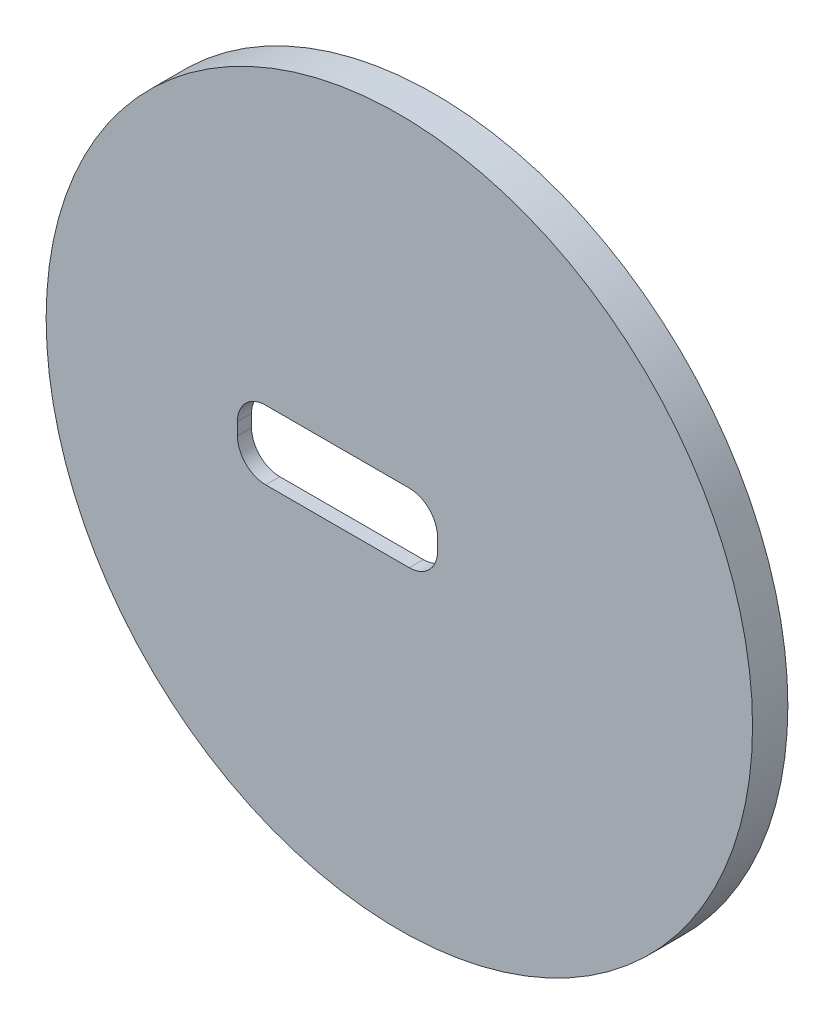
ISO-10303-21;
HEADER;
FILE_DESCRIPTION(('STEP AP214'),'2;1');
FILE_NAME('part.step','',(''),(''),'','','');
FILE_SCHEMA(('AUTOMOTIVE_DESIGN { 1 0 10303 214 1 1 1 1 }'));
ENDSEC;
DATA;
#1=APPLICATION_CONTEXT('core data for automotive mechanical design processes');
#2=APPLICATION_PROTOCOL_DEFINITION('international standard','automotive_design',2000,#1);
#3=PRODUCT_CONTEXT('',#1,'mechanical');
#4=PRODUCT('Part','Part','',(#3));
#5=PRODUCT_RELATED_PRODUCT_CATEGORY('part','',(#4));
#6=PRODUCT_DEFINITION_FORMATION('','',#4);
#7=PRODUCT_DEFINITION_CONTEXT('part definition',#1,'design');
#8=PRODUCT_DEFINITION('design','',#6,#7);
#9=PRODUCT_DEFINITION_SHAPE('','',#8);
#10=(LENGTH_UNIT() NAMED_UNIT(*) SI_UNIT(.MILLI.,.METRE.));
#11=(NAMED_UNIT(*) PLANE_ANGLE_UNIT() SI_UNIT($,.RADIAN.));
#12=(NAMED_UNIT(*) SI_UNIT($,.STERADIAN.) SOLID_ANGLE_UNIT());
#13=UNCERTAINTY_MEASURE_WITH_UNIT(LENGTH_MEASURE(1.E-05),#10,'distance_accuracy_value','');
#14=(GEOMETRIC_REPRESENTATION_CONTEXT(3) GLOBAL_UNCERTAINTY_ASSIGNED_CONTEXT((#13)) GLOBAL_UNIT_ASSIGNED_CONTEXT((#10,
#11,#12)) REPRESENTATION_CONTEXT('',''));
#15=CARTESIAN_POINT('',(0.,0.,0.));
#16=DIRECTION('',(0.,0.,1.));
#17=DIRECTION('',(1.,0.,0.));
#18=AXIS2_PLACEMENT_3D('',#15,#16,#17);
#19=CARTESIAN_POINT('',(0.,0.,0.));
#20=DIRECTION('',(0.,0.,1.));
#21=DIRECTION('',(1.,0.,0.));
#22=AXIS2_PLACEMENT_3D('',#19,#20,#21);
#23=PLANE('',#22);
#24=DIRECTION('',(0.,-1.,0.));
#25=VECTOR('',#24,1.);
#26=CARTESIAN_POINT('',(19.0883940896994,0.,0.));
#27=LINE('',#26,#25);
#28=CARTESIAN_POINT('',(19.0883940896994,13.7531168633495,0.));
#29=VERTEX_POINT('',#28);
#30=CARTESIAN_POINT('',(19.0883940896994,-13.7531168633495,0.));
#31=VERTEX_POINT('',#30);
#32=EDGE_CURVE('E400',#29,#31,#27,.T.);
#33=ORIENTED_EDGE('',*,*,#32,.T.);
#34=CARTESIAN_POINT('',(14.0083940896994,-13.7531168633495,0.));
#35=DIRECTION('',(0.,0.,1.));
#36=DIRECTION('',(1.,0.,0.));
#37=AXIS2_PLACEMENT_3D('',#34,#35,#36);
#38=CIRCLE('',#37,5.08);
#39=CARTESIAN_POINT('',(14.0083940896994,-18.8331168633495,0.));
#40=VERTEX_POINT('',#39);
#41=EDGE_CURVE('E348',#31,#40,#38,.F.);
#42=ORIENTED_EDGE('',*,*,#41,.T.);
#43=DIRECTION('',(1.,0.,0.));
#44=VECTOR('',#43,1.);
#45=CARTESIAN_POINT('',(0.,-18.8331168633495,0.));
#46=LINE('',#45,#44);
#47=CARTESIAN_POINT('',(-36.2583942936994,-18.8331168633495,0.));
#48=VERTEX_POINT('',#47);
#49=EDGE_CURVE('E389',#48,#40,#46,.T.);
#50=ORIENTED_EDGE('',*,*,#49,.F.);
#51=CARTESIAN_POINT('',(-36.2583942936994,-13.7531168633495,0.));
#52=DIRECTION('',(0.,0.,1.));
#53=DIRECTION('',(1.,0.,0.));
#54=AXIS2_PLACEMENT_3D('',#51,#52,#53);
#55=CIRCLE('',#54,5.08);
#56=CARTESIAN_POINT('',(-41.3383942936994,-13.7531168633495,0.));
#57=VERTEX_POINT('',#56);
#58=EDGE_CURVE('E344',#48,#57,#55,.F.);
#59=ORIENTED_EDGE('',*,*,#58,.T.);
#60=DIRECTION('',(0.,-1.,0.));
#61=VECTOR('',#60,1.);
#62=CARTESIAN_POINT('',(-41.3383942936994,0.,0.));
#63=LINE('',#62,#61);
#64=CARTESIAN_POINT('',(-41.3383942936994,13.7531168633495,0.));
#65=VERTEX_POINT('',#64);
#66=EDGE_CURVE('E388',#65,#57,#63,.T.);
#67=ORIENTED_EDGE('',*,*,#66,.F.);
#68=CARTESIAN_POINT('',(-36.2583942936994,13.7531168633495,0.));
#69=DIRECTION('',(0.,0.,1.));
#70=DIRECTION('',(1.,0.,0.));
#71=AXIS2_PLACEMENT_3D('',#68,#69,#70);
#72=CIRCLE('',#71,5.08);
#73=CARTESIAN_POINT('',(-36.2583942936994,18.8331168633495,0.));
#74=VERTEX_POINT('',#73);
#75=EDGE_CURVE('E342',#65,#74,#72,.F.);
#76=ORIENTED_EDGE('',*,*,#75,.T.);
#77=DIRECTION('',(1.,0.,0.));
#78=VECTOR('',#77,1.);
#79=CARTESIAN_POINT('',(0.,18.8331168633495,0.));
#80=LINE('',#79,#78);
#81=CARTESIAN_POINT('',(14.0083940896994,18.8331168633495,0.));
#82=VERTEX_POINT('',#81);
#83=EDGE_CURVE('E725',#74,#82,#80,.T.);
#84=ORIENTED_EDGE('',*,*,#83,.T.);
#85=CARTESIAN_POINT('',(14.0083940896994,13.7531168633495,0.));
#86=DIRECTION('',(0.,0.,1.));
#87=DIRECTION('',(1.,0.,0.));
#88=AXIS2_PLACEMENT_3D('',#85,#86,#87);
#89=CIRCLE('',#88,5.08);
#90=EDGE_CURVE('E346',#82,#29,#89,.F.);
#91=ORIENTED_EDGE('',*,*,#90,.T.);
#92=EDGE_LOOP('',(#33,#42,#50,#59,#67,#76,#84,#91));
#93=FACE_BOUND('',#92,.T.);
#94=DIRECTION('',(0.,-1.,0.));
#95=VECTOR('',#94,1.);
#96=CARTESIAN_POINT('',(-34.620000102,0.,0.));
#97=LINE('',#96,#95);
#98=CARTESIAN_POINT('',(-34.620000102,6.985,0.));
#99=VERTEX_POINT('',#98);
#100=CARTESIAN_POINT('',(-34.620000102,-6.985,0.));
#101=VERTEX_POINT('',#100);
#102=EDGE_CURVE('E242',#99,#101,#97,.T.);
#103=ORIENTED_EDGE('',*,*,#102,.T.);
#104=CARTESIAN_POINT('',(-28.270000102,-6.985,0.));
#105=DIRECTION('',(0.,0.,1.));
#106=DIRECTION('',(1.,0.,0.));
#107=AXIS2_PLACEMENT_3D('',#104,#105,#106);
#108=CIRCLE('',#107,6.35);
#109=CARTESIAN_POINT('',(-28.270000102,-13.335,0.));
#110=VERTEX_POINT('',#109);
#111=EDGE_CURVE('E287',#101,#110,#108,.T.);
#112=ORIENTED_EDGE('',*,*,#111,.T.);
#113=DIRECTION('',(1.,0.,0.));
#114=VECTOR('',#113,1.);
#115=CARTESIAN_POINT('',(0.,-13.335,0.));
#116=LINE('',#115,#114);
#117=CARTESIAN_POINT('',(6.019999898,-13.335,0.));
#118=VERTEX_POINT('',#117);
#119=EDGE_CURVE('E250',#110,#118,#116,.T.);
#120=ORIENTED_EDGE('',*,*,#119,.T.);
#121=CARTESIAN_POINT('',(6.019999898,-6.985,0.));
#122=DIRECTION('',(0.,0.,1.));
#123=DIRECTION('',(1.,0.,0.));
#124=AXIS2_PLACEMENT_3D('',#121,#122,#123);
#125=CIRCLE('',#124,6.35);
#126=CARTESIAN_POINT('',(12.369999898,-6.985,0.));
#127=VERTEX_POINT('',#126);
#128=EDGE_CURVE('E290',#118,#127,#125,.T.);
#129=ORIENTED_EDGE('',*,*,#128,.T.);
#130=DIRECTION('',(0.,-1.,0.));
#131=VECTOR('',#130,1.);
#132=CARTESIAN_POINT('',(12.369999898,0.,0.));
#133=LINE('',#132,#131);
#134=CARTESIAN_POINT('',(12.369999898,6.985,0.));
#135=VERTEX_POINT('',#134);
#136=EDGE_CURVE('E244',#135,#127,#133,.T.);
#137=ORIENTED_EDGE('',*,*,#136,.F.);
#138=CARTESIAN_POINT('',(6.019999898,6.985,0.));
#139=DIRECTION('',(0.,0.,1.));
#140=DIRECTION('',(1.,0.,0.));
#141=AXIS2_PLACEMENT_3D('',#138,#139,#140);
#142=CIRCLE('',#141,6.35);
#143=CARTESIAN_POINT('',(6.019999898,13.335,0.));
#144=VERTEX_POINT('',#143);
#145=EDGE_CURVE('E230',#135,#144,#142,.T.);
#146=ORIENTED_EDGE('',*,*,#145,.T.);
#147=DIRECTION('',(1.,0.,0.));
#148=VECTOR('',#147,1.);
#149=CARTESIAN_POINT('',(0.,13.335,0.));
#150=LINE('',#149,#148);
#151=CARTESIAN_POINT('',(-28.270000102,13.335,0.));
#152=VERTEX_POINT('',#151);
#153=EDGE_CURVE('E236',#152,#144,#150,.T.);
#154=ORIENTED_EDGE('',*,*,#153,.F.);
#155=CARTESIAN_POINT('',(-28.270000102,6.985,0.));
#156=DIRECTION('',(0.,0.,1.));
#157=DIRECTION('',(1.,0.,0.));
#158=AXIS2_PLACEMENT_3D('',#155,#156,#157);
#159=CIRCLE('',#158,6.35);
#160=EDGE_CURVE('E218',#152,#99,#159,.T.);
#161=ORIENTED_EDGE('',*,*,#160,.T.);
#162=EDGE_LOOP('',(#103,#112,#120,#129,#137,#146,#154,#161));
#163=FACE_BOUND('',#162,.T.);
#164=ADVANCED_FACE('F59',(#93,#163),#23,.F.);
#165=CARTESIAN_POINT('',(0.,0.,6.35));
#166=DIRECTION('',(0.,0.,1.));
#167=DIRECTION('',(1.,0.,0.));
#168=AXIS2_PLACEMENT_3D('',#165,#166,#167);
#169=PLANE('',#168);
#170=CARTESIAN_POINT('',(0.,0.,6.35));
#171=DIRECTION('',(0.,0.,1.));
#172=DIRECTION('',(1.,0.,0.));
#173=AXIS2_PLACEMENT_3D('',#170,#171,#172);
#174=CIRCLE('',#173,63.5);
#175=CARTESIAN_POINT('',(63.5,0.,6.35));
#176=VERTEX_POINT('',#175);
#177=EDGE_CURVE('E260',#176,#176,#174,.T.);
#178=ORIENTED_EDGE('',*,*,#177,.T.);
#179=EDGE_LOOP('',(#178));
#180=FACE_BOUND('',#179,.T.);
#181=DIRECTION('',(-1.,0.,0.));
#182=VECTOR('',#181,1.);
#183=CARTESIAN_POINT('',(-29.1104197079243,6.19805427595517,6.35));
#184=LINE('',#183,#182);
#185=CARTESIAN_POINT('',(1.78041950392432,6.19805427595517,6.35));
#186=VERTEX_POINT('',#185);
#187=CARTESIAN_POINT('',(-24.0304197079243,6.19805427595517,6.35));
#188=VERTEX_POINT('',#187);
#189=EDGE_CURVE('E403',#186,#188,#184,.T.);
#190=ORIENTED_EDGE('',*,*,#189,.F.);
#191=CARTESIAN_POINT('',(1.78041950392433,1.11805427595517,6.35));
#192=DIRECTION('',(0.,0.,1.));
#193=DIRECTION('',(1.,0.,0.));
#194=AXIS2_PLACEMENT_3D('',#191,#192,#193);
#195=CIRCLE('',#194,5.08);
#196=CARTESIAN_POINT('',(6.86041950392433,1.11805427595517,6.35));
#197=VERTEX_POINT('',#196);
#198=EDGE_CURVE('E334',#186,#197,#195,.F.);
#199=ORIENTED_EDGE('',*,*,#198,.T.);
#200=DIRECTION('',(0.,1.,0.));
#201=VECTOR('',#200,1.);
#202=CARTESIAN_POINT('',(6.86041950392433,6.19805427595517,6.35));
#203=LINE('',#202,#201);
#204=CARTESIAN_POINT('',(6.86041950392433,-1.11805427595517,6.35));
#205=VERTEX_POINT('',#204);
#206=EDGE_CURVE('E405',#205,#197,#203,.T.);
#207=ORIENTED_EDGE('',*,*,#206,.F.);
#208=CARTESIAN_POINT('',(1.78041950392432,-1.11805427595517,6.35));
#209=DIRECTION('',(0.,0.,1.));
#210=DIRECTION('',(1.,0.,0.));
#211=AXIS2_PLACEMENT_3D('',#208,#209,#210);
#212=CIRCLE('',#211,5.08);
#213=CARTESIAN_POINT('',(1.78041950392432,-6.19805427595517,6.35));
#214=VERTEX_POINT('',#213);
#215=EDGE_CURVE('E337',#205,#214,#212,.F.);
#216=ORIENTED_EDGE('',*,*,#215,.T.);
#217=DIRECTION('',(1.,0.,0.));
#218=VECTOR('',#217,1.);
#219=CARTESIAN_POINT('',(-29.1104197079243,-6.19805427595517,6.35));
#220=LINE('',#219,#218);
#221=CARTESIAN_POINT('',(-24.0304197079243,-6.19805427595517,6.35));
#222=VERTEX_POINT('',#221);
#223=EDGE_CURVE('E249',#222,#214,#220,.T.);
#224=ORIENTED_EDGE('',*,*,#223,.F.);
#225=CARTESIAN_POINT('',(-24.0304197079243,-1.11805427595517,6.35));
#226=DIRECTION('',(0.,0.,1.));
#227=DIRECTION('',(1.,0.,0.));
#228=AXIS2_PLACEMENT_3D('',#225,#226,#227);
#229=CIRCLE('',#228,5.08);
#230=CARTESIAN_POINT('',(-29.1104197079243,-1.11805427595517,6.35));
#231=VERTEX_POINT('',#230);
#232=EDGE_CURVE('E323',#222,#231,#229,.F.);
#233=ORIENTED_EDGE('',*,*,#232,.T.);
#234=DIRECTION('',(0.,-1.,0.));
#235=VECTOR('',#234,1.);
#236=CARTESIAN_POINT('',(-29.1104197079243,6.19805427595517,6.35));
#237=LINE('',#236,#235);
#238=CARTESIAN_POINT('',(-29.1104197079243,1.11805427595517,6.35));
#239=VERTEX_POINT('',#238);
#240=EDGE_CURVE('E408',#239,#231,#237,.T.);
#241=ORIENTED_EDGE('',*,*,#240,.F.);
#242=CARTESIAN_POINT('',(-24.0304197079243,1.11805427595517,6.35));
#243=DIRECTION('',(0.,0.,1.));
#244=DIRECTION('',(1.,0.,0.));
#245=AXIS2_PLACEMENT_3D('',#242,#243,#244);
#246=CIRCLE('',#245,5.08);
#247=EDGE_CURVE('E330',#239,#188,#246,.F.);
#248=ORIENTED_EDGE('',*,*,#247,.T.);
#249=EDGE_LOOP('',(#190,#199,#207,#216,#224,#233,#241,#248));
#250=FACE_BOUND('',#249,.T.);
#251=ADVANCED_FACE('F456',(#180,#250),#169,.T.);
#252=CARTESIAN_POINT('',(0.,0.,3.81));
#253=DIRECTION('',(0.,0.,1.));
#254=DIRECTION('',(1.,0.,0.));
#255=AXIS2_PLACEMENT_3D('',#252,#253,#254);
#256=PLANE('',#255);
#257=DIRECTION('',(0.,-1.,0.));
#258=VECTOR('',#257,1.);
#259=CARTESIAN_POINT('',(-34.620000102,0.,3.81));
#260=LINE('',#259,#258);
#261=CARTESIAN_POINT('',(-34.620000102,6.985,3.81));
#262=VERTEX_POINT('',#261);
#263=CARTESIAN_POINT('',(-34.620000102,-6.985,3.81));
#264=VERTEX_POINT('',#263);
#265=EDGE_CURVE('E419',#262,#264,#260,.T.);
#266=ORIENTED_EDGE('',*,*,#265,.F.);
#267=CARTESIAN_POINT('',(-28.270000102,6.985,3.81));
#268=DIRECTION('',(0.,0.,1.));
#269=DIRECTION('',(1.,0.,0.));
#270=AXIS2_PLACEMENT_3D('',#267,#268,#269);
#271=CIRCLE('',#270,6.35);
#272=CARTESIAN_POINT('',(-28.270000102,13.335,3.81));
#273=VERTEX_POINT('',#272);
#274=EDGE_CURVE('E274',#262,#273,#271,.F.);
#275=ORIENTED_EDGE('',*,*,#274,.T.);
#276=DIRECTION('',(1.,0.,0.));
#277=VECTOR('',#276,1.);
#278=CARTESIAN_POINT('',(0.,13.335,3.81));
#279=LINE('',#278,#277);
#280=CARTESIAN_POINT('',(6.019999898,13.335,3.81));
#281=VERTEX_POINT('',#280);
#282=EDGE_CURVE('E237',#273,#281,#279,.T.);
#283=ORIENTED_EDGE('',*,*,#282,.T.);
#284=CARTESIAN_POINT('',(6.019999898,6.985,3.81));
#285=DIRECTION('',(0.,0.,1.));
#286=DIRECTION('',(1.,0.,0.));
#287=AXIS2_PLACEMENT_3D('',#284,#285,#286);
#288=CIRCLE('',#287,6.35);
#289=CARTESIAN_POINT('',(12.369999898,6.985,3.81));
#290=VERTEX_POINT('',#289);
#291=EDGE_CURVE('E275',#281,#290,#288,.F.);
#292=ORIENTED_EDGE('',*,*,#291,.T.);
#293=DIRECTION('',(0.,-1.,0.));
#294=VECTOR('',#293,1.);
#295=CARTESIAN_POINT('',(12.369999898,0.,3.81));
#296=LINE('',#295,#294);
#297=CARTESIAN_POINT('',(12.369999898,-6.985,3.81));
#298=VERTEX_POINT('',#297);
#299=EDGE_CURVE('E256',#290,#298,#296,.T.);
#300=ORIENTED_EDGE('',*,*,#299,.T.);
#301=CARTESIAN_POINT('',(6.019999898,-6.985,3.81));
#302=DIRECTION('',(0.,0.,1.));
#303=DIRECTION('',(1.,0.,0.));
#304=AXIS2_PLACEMENT_3D('',#301,#302,#303);
#305=CIRCLE('',#304,6.35);
#306=CARTESIAN_POINT('',(6.019999898,-13.335,3.81));
#307=VERTEX_POINT('',#306);
#308=EDGE_CURVE('E270',#298,#307,#305,.F.);
#309=ORIENTED_EDGE('',*,*,#308,.T.);
#310=DIRECTION('',(1.,0.,0.));
#311=VECTOR('',#310,1.);
#312=CARTESIAN_POINT('',(0.,-13.335,3.81));
#313=LINE('',#312,#311);
#314=CARTESIAN_POINT('',(-28.270000102,-13.335,3.81));
#315=VERTEX_POINT('',#314);
#316=EDGE_CURVE('E265',#315,#307,#313,.T.);
#317=ORIENTED_EDGE('',*,*,#316,.F.);
#318=CARTESIAN_POINT('',(-28.270000102,-6.985,3.81));
#319=DIRECTION('',(0.,0.,1.));
#320=DIRECTION('',(1.,0.,0.));
#321=AXIS2_PLACEMENT_3D('',#318,#319,#320);
#322=CIRCLE('',#321,6.35);
#323=EDGE_CURVE('E268',#315,#264,#322,.F.);
#324=ORIENTED_EDGE('',*,*,#323,.T.);
#325=EDGE_LOOP('',(#266,#275,#283,#292,#300,#309,#317,#324));
#326=FACE_BOUND('',#325,.T.);
#327=DIRECTION('',(0.,-1.,0.));
#328=VECTOR('',#327,1.);
#329=CARTESIAN_POINT('',(6.86041950392433,0.,3.81));
#330=LINE('',#329,#328);
#331=CARTESIAN_POINT('',(6.86041950392433,1.11805427595517,3.81));
#332=VERTEX_POINT('',#331);
#333=CARTESIAN_POINT('',(6.86041950392433,-1.11805427595517,3.81));
#334=VERTEX_POINT('',#333);
#335=EDGE_CURVE('E299',#332,#334,#330,.T.);
#336=ORIENTED_EDGE('',*,*,#335,.F.);
#337=CARTESIAN_POINT('',(1.78041950392433,1.11805427595517,3.81));
#338=DIRECTION('',(0.,0.,1.));
#339=DIRECTION('',(1.,0.,0.));
#340=AXIS2_PLACEMENT_3D('',#337,#338,#339);
#341=CIRCLE('',#340,5.08);
#342=CARTESIAN_POINT('',(1.78041950392433,6.19805427595517,3.81));
#343=VERTEX_POINT('',#342);
#344=EDGE_CURVE('E327',#332,#343,#341,.T.);
#345=ORIENTED_EDGE('',*,*,#344,.T.);
#346=DIRECTION('',(1.,0.,0.));
#347=VECTOR('',#346,1.);
#348=CARTESIAN_POINT('',(0.,6.19805427595517,3.81));
#349=LINE('',#348,#347);
#350=CARTESIAN_POINT('',(-24.0304197079243,6.19805427595517,3.81));
#351=VERTEX_POINT('',#350);
#352=EDGE_CURVE('E298',#351,#343,#349,.T.);
#353=ORIENTED_EDGE('',*,*,#352,.F.);
#354=CARTESIAN_POINT('',(-24.0304197079243,1.11805427595517,3.81));
#355=DIRECTION('',(0.,0.,1.));
#356=DIRECTION('',(1.,0.,0.));
#357=AXIS2_PLACEMENT_3D('',#354,#355,#356);
#358=CIRCLE('',#357,5.08);
#359=CARTESIAN_POINT('',(-29.1104197079243,1.11805427595517,3.81));
#360=VERTEX_POINT('',#359);
#361=EDGE_CURVE('E329',#351,#360,#358,.T.);
#362=ORIENTED_EDGE('',*,*,#361,.T.);
#363=DIRECTION('',(0.,1.,0.));
#364=VECTOR('',#363,1.);
#365=CARTESIAN_POINT('',(-29.1104197079243,0.,3.81));
#366=LINE('',#365,#364);
#367=CARTESIAN_POINT('',(-29.1104197079243,-1.11805427595517,3.81));
#368=VERTEX_POINT('',#367);
#369=EDGE_CURVE('E291',#368,#360,#366,.T.);
#370=ORIENTED_EDGE('',*,*,#369,.F.);
#371=CARTESIAN_POINT('',(-24.0304197079243,-1.11805427595517,3.81));
#372=DIRECTION('',(0.,0.,1.));
#373=DIRECTION('',(1.,0.,0.));
#374=AXIS2_PLACEMENT_3D('',#371,#372,#373);
#375=CIRCLE('',#374,5.08);
#376=CARTESIAN_POINT('',(-24.0304197079243,-6.19805427595517,3.81));
#377=VERTEX_POINT('',#376);
#378=EDGE_CURVE('E325',#368,#377,#375,.T.);
#379=ORIENTED_EDGE('',*,*,#378,.T.);
#380=DIRECTION('',(-1.,0.,0.));
#381=VECTOR('',#380,1.);
#382=CARTESIAN_POINT('',(0.,-6.19805427595517,3.81));
#383=LINE('',#382,#381);
#384=CARTESIAN_POINT('',(1.78041950392432,-6.19805427595517,3.81));
#385=VERTEX_POINT('',#384);
#386=EDGE_CURVE('E288',#385,#377,#383,.T.);
#387=ORIENTED_EDGE('',*,*,#386,.F.);
#388=CARTESIAN_POINT('',(1.78041950392432,-1.11805427595517,3.81));
#389=DIRECTION('',(0.,0.,1.));
#390=DIRECTION('',(1.,0.,0.));
#391=AXIS2_PLACEMENT_3D('',#388,#389,#390);
#392=CIRCLE('',#391,5.08);
#393=EDGE_CURVE('E331',#385,#334,#392,.T.);
#394=ORIENTED_EDGE('',*,*,#393,.T.);
#395=EDGE_LOOP('',(#336,#345,#353,#362,#370,#379,#387,#394));
#396=FACE_BOUND('',#395,.T.);
#397=ADVANCED_FACE('F439',(#326,#396),#256,.F.);
#398=CARTESIAN_POINT('',(0.,0.,6.35));
#399=DIRECTION('',(0.,0.,-1.));
#400=DIRECTION('',(-1.,0.,0.));
#401=AXIS2_PLACEMENT_3D('',#398,#399,#400);
#402=CYLINDRICAL_SURFACE('',#401,63.5);
#403=ORIENTED_EDGE('',*,*,#177,.F.);
#404=EDGE_LOOP('',(#403));
#405=FACE_BOUND('',#404,.T.);
#406=CARTESIAN_POINT('',(0.,0.,0.));
#407=DIRECTION('',(0.,0.,1.));
#408=DIRECTION('',(1.,0.,0.));
#409=AXIS2_PLACEMENT_3D('',#406,#407,#408);
#410=CIRCLE('',#409,63.5);
#411=CARTESIAN_POINT('',(63.5,0.,0.));
#412=VERTEX_POINT('',#411);
#413=EDGE_CURVE('E259',#412,#412,#410,.T.);
#414=ORIENTED_EDGE('',*,*,#413,.T.);
#415=EDGE_LOOP('',(#414));
#416=FACE_BOUND('',#415,.T.);
#417=ADVANCED_FACE('F469',(#405,#416),#402,.T.);
#418=CARTESIAN_POINT('',(0.,0.,0.));
#419=DIRECTION('',(0.,0.,1.));
#420=DIRECTION('',(1.,0.,0.));
#421=AXIS2_PLACEMENT_3D('',#418,#419,#420);
#422=CIRCLE('',#421,57.15);
#423=CARTESIAN_POINT('',(-57.15,0.,0.));
#424=VERTEX_POINT('',#423);
#425=EDGE_CURVE('E395',#424,#424,#422,.T.);
#426=ORIENTED_EDGE('',*,*,#425,.T.);
#427=EDGE_LOOP('',(#426));
#428=FACE_BOUND('',#427,.T.);
#429=ORIENTED_EDGE('',*,*,#413,.F.);
#430=EDGE_LOOP('',(#429));
#431=FACE_BOUND('',#430,.T.);
#432=ADVANCED_FACE('F458',(#428,#431),#23,.F.);
#433=CARTESIAN_POINT('',(12.369999898,0.,3.81));
#434=DIRECTION('',(1.,0.,0.));
#435=DIRECTION('',(0.,1.,0.));
#436=AXIS2_PLACEMENT_3D('',#433,#434,#435);
#437=PLANE('',#436);
#438=ORIENTED_EDGE('',*,*,#299,.F.);
#439=DIRECTION('',(0.,0.,-1.));
#440=VECTOR('',#439,1.);
#441=CARTESIAN_POINT('',(12.369999898,6.985,0.));
#442=LINE('',#441,#440);
#443=EDGE_CURVE('E277',#290,#135,#442,.T.);
#444=ORIENTED_EDGE('',*,*,#443,.T.);
#445=ORIENTED_EDGE('',*,*,#136,.T.);
#446=DIRECTION('',(0.,0.,-1.));
#447=VECTOR('',#446,1.);
#448=CARTESIAN_POINT('',(12.369999898,-6.985,3.81));
#449=LINE('',#448,#447);
#450=EDGE_CURVE('E276',#127,#298,#449,.F.);
#451=ORIENTED_EDGE('',*,*,#450,.T.);
#452=EDGE_LOOP('',(#438,#444,#445,#451));
#453=FACE_BOUND('',#452,.T.);
#454=ADVANCED_FACE('F432',(#453),#437,.F.);
#455=CARTESIAN_POINT('',(0.,13.335,3.81));
#456=DIRECTION('',(0.,1.,0.));
#457=DIRECTION('',(0.,0.,1.));
#458=AXIS2_PLACEMENT_3D('',#455,#456,#457);
#459=PLANE('',#458);
#460=ORIENTED_EDGE('',*,*,#282,.F.);
#461=DIRECTION('',(0.,0.,-1.));
#462=VECTOR('',#461,1.);
#463=CARTESIAN_POINT('',(-28.270000102,13.335,3.81));
#464=LINE('',#463,#462);
#465=EDGE_CURVE('E225',#273,#152,#464,.T.);
#466=ORIENTED_EDGE('',*,*,#465,.T.);
#467=ORIENTED_EDGE('',*,*,#153,.T.);
#468=DIRECTION('',(0.,0.,-1.));
#469=VECTOR('',#468,1.);
#470=CARTESIAN_POINT('',(6.019999898,13.335,3.81));
#471=LINE('',#470,#469);
#472=EDGE_CURVE('E241',#144,#281,#471,.F.);
#473=ORIENTED_EDGE('',*,*,#472,.T.);
#474=EDGE_LOOP('',(#460,#466,#467,#473));
#475=FACE_BOUND('',#474,.T.);
#476=ADVANCED_FACE('F232',(#475),#459,.F.);
#477=CARTESIAN_POINT('',(-34.620000102,0.,3.81));
#478=DIRECTION('',(1.,0.,0.));
#479=DIRECTION('',(0.,0.,-1.));
#480=AXIS2_PLACEMENT_3D('',#477,#478,#479);
#481=PLANE('',#480);
#482=ORIENTED_EDGE('',*,*,#102,.F.);
#483=DIRECTION('',(0.,0.,-1.));
#484=VECTOR('',#483,1.);
#485=CARTESIAN_POINT('',(-34.620000102,6.985,3.81));
#486=LINE('',#485,#484);
#487=EDGE_CURVE('E221',#99,#262,#486,.F.);
#488=ORIENTED_EDGE('',*,*,#487,.T.);
#489=ORIENTED_EDGE('',*,*,#265,.T.);
#490=DIRECTION('',(0.,0.,-1.));
#491=VECTOR('',#490,1.);
#492=CARTESIAN_POINT('',(-34.620000102,-6.985,0.));
#493=LINE('',#492,#491);
#494=EDGE_CURVE('E239',#264,#101,#493,.T.);
#495=ORIENTED_EDGE('',*,*,#494,.T.);
#496=EDGE_LOOP('',(#482,#488,#489,#495));
#497=FACE_BOUND('',#496,.T.);
#498=ADVANCED_FACE('F443',(#497),#481,.T.);
#499=CARTESIAN_POINT('',(0.,-13.335,3.81));
#500=DIRECTION('',(0.,1.,0.));
#501=DIRECTION('',(0.,0.,1.));
#502=AXIS2_PLACEMENT_3D('',#499,#500,#501);
#503=PLANE('',#502);
#504=ORIENTED_EDGE('',*,*,#119,.F.);
#505=DIRECTION('',(0.,0.,-1.));
#506=VECTOR('',#505,1.);
#507=CARTESIAN_POINT('',(-28.270000102,-13.335,3.81));
#508=LINE('',#507,#506);
#509=EDGE_CURVE('E229',#110,#315,#508,.F.);
#510=ORIENTED_EDGE('',*,*,#509,.T.);
#511=ORIENTED_EDGE('',*,*,#316,.T.);
#512=DIRECTION('',(0.,0.,-1.));
#513=VECTOR('',#512,1.);
#514=CARTESIAN_POINT('',(6.019999898,-13.335,3.81));
#515=LINE('',#514,#513);
#516=EDGE_CURVE('E284',#307,#118,#515,.T.);
#517=ORIENTED_EDGE('',*,*,#516,.T.);
#518=EDGE_LOOP('',(#504,#510,#511,#517));
#519=FACE_BOUND('',#518,.T.);
#520=ADVANCED_FACE('F425',(#519),#503,.T.);
#521=CARTESIAN_POINT('',(-28.270000102,6.985,3.81));
#522=DIRECTION('',(0.,0.,-1.));
#523=DIRECTION('',(-1.,0.,0.));
#524=AXIS2_PLACEMENT_3D('',#521,#522,#523);
#525=CYLINDRICAL_SURFACE('',#524,6.35);
#526=ORIENTED_EDGE('',*,*,#274,.F.);
#527=ORIENTED_EDGE('',*,*,#487,.F.);
#528=ORIENTED_EDGE('',*,*,#160,.F.);
#529=ORIENTED_EDGE('',*,*,#465,.F.);
#530=EDGE_LOOP('',(#526,#527,#528,#529));
#531=FACE_BOUND('',#530,.T.);
#532=ADVANCED_FACE('F224',(#531),#525,.F.);
#533=CARTESIAN_POINT('',(6.019999898,6.985,3.81));
#534=DIRECTION('',(0.,0.,1.));
#535=DIRECTION('',(1.,0.,0.));
#536=AXIS2_PLACEMENT_3D('',#533,#534,#535);
#537=CYLINDRICAL_SURFACE('',#536,6.35);
#538=ORIENTED_EDGE('',*,*,#291,.F.);
#539=ORIENTED_EDGE('',*,*,#472,.F.);
#540=ORIENTED_EDGE('',*,*,#145,.F.);
#541=ORIENTED_EDGE('',*,*,#443,.F.);
#542=EDGE_LOOP('',(#538,#539,#540,#541));
#543=FACE_BOUND('',#542,.T.);
#544=ADVANCED_FACE('F438',(#543),#537,.F.);
#545=CARTESIAN_POINT('',(-28.270000102,-6.985,3.81));
#546=DIRECTION('',(0.,0.,1.));
#547=DIRECTION('',(1.,0.,0.));
#548=AXIS2_PLACEMENT_3D('',#545,#546,#547);
#549=CYLINDRICAL_SURFACE('',#548,6.35);
#550=ORIENTED_EDGE('',*,*,#323,.F.);
#551=ORIENTED_EDGE('',*,*,#509,.F.);
#552=ORIENTED_EDGE('',*,*,#111,.F.);
#553=ORIENTED_EDGE('',*,*,#494,.F.);
#554=EDGE_LOOP('',(#550,#551,#552,#553));
#555=FACE_BOUND('',#554,.T.);
#556=ADVANCED_FACE('F447',(#555),#549,.F.);
#557=CARTESIAN_POINT('',(6.019999898,-6.985,3.81));
#558=DIRECTION('',(0.,0.,-1.));
#559=DIRECTION('',(-1.,0.,0.));
#560=AXIS2_PLACEMENT_3D('',#557,#558,#559);
#561=CYLINDRICAL_SURFACE('',#560,6.35);
#562=ORIENTED_EDGE('',*,*,#308,.F.);
#563=ORIENTED_EDGE('',*,*,#450,.F.);
#564=ORIENTED_EDGE('',*,*,#128,.F.);
#565=ORIENTED_EDGE('',*,*,#516,.F.);
#566=EDGE_LOOP('',(#562,#563,#564,#565));
#567=FACE_BOUND('',#566,.T.);
#568=ADVANCED_FACE('F427',(#567),#561,.F.);
#569=CARTESIAN_POINT('',(6.86041950392433,6.19805427595517,6.35));
#570=DIRECTION('',(-1.,0.,0.));
#571=DIRECTION('',(0.,0.,1.));
#572=AXIS2_PLACEMENT_3D('',#569,#570,#571);
#573=PLANE('',#572);
#574=ORIENTED_EDGE('',*,*,#206,.T.);
#575=DIRECTION('',(0.,0.,-1.));
#576=VECTOR('',#575,1.);
#577=CARTESIAN_POINT('',(6.86041950392433,1.11805427595517,3.81));
#578=LINE('',#577,#576);
#579=EDGE_CURVE('E316',#197,#332,#578,.T.);
#580=ORIENTED_EDGE('',*,*,#579,.T.);
#581=ORIENTED_EDGE('',*,*,#335,.T.);
#582=DIRECTION('',(0.,0.,-1.));
#583=VECTOR('',#582,1.);
#584=CARTESIAN_POINT('',(6.86041950392433,-1.11805427595517,6.35));
#585=LINE('',#584,#583);
#586=EDGE_CURVE('E320',#334,#205,#585,.F.);
#587=ORIENTED_EDGE('',*,*,#586,.T.);
#588=EDGE_LOOP('',(#574,#580,#581,#587));
#589=FACE_BOUND('',#588,.T.);
#590=ADVANCED_FACE('F452',(#589),#573,.T.);
#591=CARTESIAN_POINT('',(-29.1104197079243,6.19805427595517,6.35));
#592=DIRECTION('',(0.,-1.,0.));
#593=DIRECTION('',(0.,0.,-1.));
#594=AXIS2_PLACEMENT_3D('',#591,#592,#593);
#595=PLANE('',#594);
#596=ORIENTED_EDGE('',*,*,#189,.T.);
#597=DIRECTION('',(0.,0.,-1.));
#598=VECTOR('',#597,1.);
#599=CARTESIAN_POINT('',(-24.0304197079243,6.19805427595517,3.81));
#600=LINE('',#599,#598);
#601=EDGE_CURVE('E313',#188,#351,#600,.T.);
#602=ORIENTED_EDGE('',*,*,#601,.T.);
#603=ORIENTED_EDGE('',*,*,#352,.T.);
#604=DIRECTION('',(0.,0.,-1.));
#605=VECTOR('',#604,1.);
#606=CARTESIAN_POINT('',(1.78041950392433,6.19805427595517,6.35));
#607=LINE('',#606,#605);
#608=EDGE_CURVE('E315',#343,#186,#607,.F.);
#609=ORIENTED_EDGE('',*,*,#608,.T.);
#610=EDGE_LOOP('',(#596,#602,#603,#609));
#611=FACE_BOUND('',#610,.T.);
#612=ADVANCED_FACE('F514',(#611),#595,.T.);
#613=CARTESIAN_POINT('',(-29.1104197079243,6.19805427595517,6.35));
#614=DIRECTION('',(1.,0.,0.));
#615=DIRECTION('',(0.,0.,-1.));
#616=AXIS2_PLACEMENT_3D('',#613,#614,#615);
#617=PLANE('',#616);
#618=ORIENTED_EDGE('',*,*,#240,.T.);
#619=DIRECTION('',(0.,0.,-1.));
#620=VECTOR('',#619,1.);
#621=CARTESIAN_POINT('',(-29.1104197079243,-1.11805427595517,3.81));
#622=LINE('',#621,#620);
#623=EDGE_CURVE('E302',#231,#368,#622,.T.);
#624=ORIENTED_EDGE('',*,*,#623,.T.);
#625=ORIENTED_EDGE('',*,*,#369,.T.);
#626=DIRECTION('',(0.,0.,-1.));
#627=VECTOR('',#626,1.);
#628=CARTESIAN_POINT('',(-29.1104197079243,1.11805427595517,6.35));
#629=LINE('',#628,#627);
#630=EDGE_CURVE('E305',#360,#239,#629,.F.);
#631=ORIENTED_EDGE('',*,*,#630,.T.);
#632=EDGE_LOOP('',(#618,#624,#625,#631));
#633=FACE_BOUND('',#632,.T.);
#634=ADVANCED_FACE('F508',(#633),#617,.T.);
#635=CARTESIAN_POINT('',(-29.1104197079243,-6.19805427595517,6.35));
#636=DIRECTION('',(0.,1.,0.));
#637=DIRECTION('',(0.,0.,1.));
#638=AXIS2_PLACEMENT_3D('',#635,#636,#637);
#639=PLANE('',#638);
#640=ORIENTED_EDGE('',*,*,#386,.T.);
#641=DIRECTION('',(0.,0.,-1.));
#642=VECTOR('',#641,1.);
#643=CARTESIAN_POINT('',(-24.0304197079243,-6.19805427595517,6.35));
#644=LINE('',#643,#642);
#645=EDGE_CURVE('E309',#377,#222,#644,.F.);
#646=ORIENTED_EDGE('',*,*,#645,.T.);
#647=ORIENTED_EDGE('',*,*,#223,.T.);
#648=DIRECTION('',(0.,0.,-1.));
#649=VECTOR('',#648,1.);
#650=CARTESIAN_POINT('',(1.78041950392432,-6.19805427595517,3.81));
#651=LINE('',#650,#649);
#652=EDGE_CURVE('E310',#214,#385,#651,.T.);
#653=ORIENTED_EDGE('',*,*,#652,.T.);
#654=EDGE_LOOP('',(#640,#646,#647,#653));
#655=FACE_BOUND('',#654,.T.);
#656=ADVANCED_FACE('F504',(#655),#639,.T.);
#657=CARTESIAN_POINT('',(-24.0304197079243,-1.11805427595517,6.35));
#658=DIRECTION('',(0.,0.,1.));
#659=DIRECTION('',(1.,0.,0.));
#660=AXIS2_PLACEMENT_3D('',#657,#658,#659);
#661=CYLINDRICAL_SURFACE('',#660,5.08);
#662=ORIENTED_EDGE('',*,*,#232,.F.);
#663=ORIENTED_EDGE('',*,*,#645,.F.);
#664=ORIENTED_EDGE('',*,*,#378,.F.);
#665=ORIENTED_EDGE('',*,*,#623,.F.);
#666=EDGE_LOOP('',(#662,#663,#664,#665));
#667=FACE_BOUND('',#666,.T.);
#668=ADVANCED_FACE('F507',(#667),#661,.F.);
#669=CARTESIAN_POINT('',(-24.0304197079243,1.11805427595517,6.35));
#670=DIRECTION('',(0.,0.,1.));
#671=DIRECTION('',(1.,0.,0.));
#672=AXIS2_PLACEMENT_3D('',#669,#670,#671);
#673=CYLINDRICAL_SURFACE('',#672,5.08);
#674=ORIENTED_EDGE('',*,*,#247,.F.);
#675=ORIENTED_EDGE('',*,*,#630,.F.);
#676=ORIENTED_EDGE('',*,*,#361,.F.);
#677=ORIENTED_EDGE('',*,*,#601,.F.);
#678=EDGE_LOOP('',(#674,#675,#676,#677));
#679=FACE_BOUND('',#678,.T.);
#680=ADVANCED_FACE('F611',(#679),#673,.F.);
#681=CARTESIAN_POINT('',(1.78041950392433,1.11805427595517,6.35));
#682=DIRECTION('',(0.,0.,1.));
#683=DIRECTION('',(1.,0.,0.));
#684=AXIS2_PLACEMENT_3D('',#681,#682,#683);
#685=CYLINDRICAL_SURFACE('',#684,5.08);
#686=ORIENTED_EDGE('',*,*,#198,.F.);
#687=ORIENTED_EDGE('',*,*,#608,.F.);
#688=ORIENTED_EDGE('',*,*,#344,.F.);
#689=ORIENTED_EDGE('',*,*,#579,.F.);
#690=EDGE_LOOP('',(#686,#687,#688,#689));
#691=FACE_BOUND('',#690,.T.);
#692=ADVANCED_FACE('F624',(#691),#685,.F.);
#693=CARTESIAN_POINT('',(1.78041950392432,-1.11805427595517,6.35));
#694=DIRECTION('',(0.,0.,1.));
#695=DIRECTION('',(1.,0.,0.));
#696=AXIS2_PLACEMENT_3D('',#693,#694,#695);
#697=CYLINDRICAL_SURFACE('',#696,5.08);
#698=ORIENTED_EDGE('',*,*,#215,.F.);
#699=ORIENTED_EDGE('',*,*,#586,.F.);
#700=ORIENTED_EDGE('',*,*,#393,.F.);
#701=ORIENTED_EDGE('',*,*,#652,.F.);
#702=EDGE_LOOP('',(#698,#699,#700,#701));
#703=FACE_BOUND('',#702,.T.);
#704=ADVANCED_FACE('F503',(#703),#697,.F.);
#705=CARTESIAN_POINT('',(0.,18.8331168633495,3.81));
#706=DIRECTION('',(0.,1.,0.));
#707=DIRECTION('',(0.,0.,1.));
#708=AXIS2_PLACEMENT_3D('',#705,#706,#707);
#709=PLANE('',#708);
#710=DIRECTION('',(1.,0.,0.));
#711=VECTOR('',#710,1.);
#712=CARTESIAN_POINT('',(0.,18.8331168633495,3.81));
#713=LINE('',#712,#711);
#714=CARTESIAN_POINT('',(-36.2583942936994,18.8331168633495,3.81));
#715=VERTEX_POINT('',#714);
#716=CARTESIAN_POINT('',(14.0083940896994,18.8331168633495,3.81));
#717=VERTEX_POINT('',#716);
#718=EDGE_CURVE('E397',#715,#717,#713,.T.);
#719=ORIENTED_EDGE('',*,*,#718,.T.);
#720=DIRECTION('',(0.,0.,-1.));
#721=VECTOR('',#720,1.);
#722=CARTESIAN_POINT('',(14.0083940896994,18.8331168633495,3.81));
#723=LINE('',#722,#721);
#724=EDGE_CURVE('E356',#717,#82,#723,.T.);
#725=ORIENTED_EDGE('',*,*,#724,.T.);
#726=ORIENTED_EDGE('',*,*,#83,.F.);
#727=DIRECTION('',(0.,0.,-1.));
#728=VECTOR('',#727,1.);
#729=CARTESIAN_POINT('',(-36.2583942936994,18.8331168633495,3.81));
#730=LINE('',#729,#728);
#731=EDGE_CURVE('E358',#74,#715,#730,.F.);
#732=ORIENTED_EDGE('',*,*,#731,.T.);
#733=EDGE_LOOP('',(#719,#725,#726,#732));
#734=FACE_BOUND('',#733,.T.);
#735=ADVANCED_FACE('F499',(#734),#709,.T.);
#736=CARTESIAN_POINT('',(19.0883940896994,0.,3.81));
#737=DIRECTION('',(1.,0.,0.));
#738=DIRECTION('',(0.,1.,0.));
#739=AXIS2_PLACEMENT_3D('',#736,#737,#738);
#740=PLANE('',#739);
#741=DIRECTION('',(0.,-1.,0.));
#742=VECTOR('',#741,1.);
#743=CARTESIAN_POINT('',(19.0883940896994,0.,3.81));
#744=LINE('',#743,#742);
#745=CARTESIAN_POINT('',(19.0883940896994,13.7531168633495,3.81));
#746=VERTEX_POINT('',#745);
#747=CARTESIAN_POINT('',(19.0883940896994,-13.7531168633495,3.81));
#748=VERTEX_POINT('',#747);
#749=EDGE_CURVE('E384',#746,#748,#744,.T.);
#750=ORIENTED_EDGE('',*,*,#749,.T.);
#751=DIRECTION('',(0.,0.,-1.));
#752=VECTOR('',#751,1.);
#753=CARTESIAN_POINT('',(19.0883940896994,-13.7531168633495,0.));
#754=LINE('',#753,#752);
#755=EDGE_CURVE('E338',#748,#31,#754,.T.);
#756=ORIENTED_EDGE('',*,*,#755,.T.);
#757=ORIENTED_EDGE('',*,*,#32,.F.);
#758=DIRECTION('',(0.,0.,-1.));
#759=VECTOR('',#758,1.);
#760=CARTESIAN_POINT('',(19.0883940896994,13.7531168633495,3.81));
#761=LINE('',#760,#759);
#762=EDGE_CURVE('E336',#29,#746,#761,.F.);
#763=ORIENTED_EDGE('',*,*,#762,.T.);
#764=EDGE_LOOP('',(#750,#756,#757,#763));
#765=FACE_BOUND('',#764,.T.);
#766=ADVANCED_FACE('F500',(#765),#740,.T.);
#767=CARTESIAN_POINT('',(0.,-18.8331168633495,3.81));
#768=DIRECTION('',(0.,1.,0.));
#769=DIRECTION('',(0.,0.,1.));
#770=AXIS2_PLACEMENT_3D('',#767,#768,#769);
#771=PLANE('',#770);
#772=ORIENTED_EDGE('',*,*,#49,.T.);
#773=DIRECTION('',(0.,0.,-1.));
#774=VECTOR('',#773,1.);
#775=CARTESIAN_POINT('',(14.0083940896994,-18.8331168633495,3.81));
#776=LINE('',#775,#774);
#777=CARTESIAN_POINT('',(14.0083940896994,-18.8331168633495,3.81));
#778=VERTEX_POINT('',#777);
#779=EDGE_CURVE('E351',#40,#778,#776,.F.);
#780=ORIENTED_EDGE('',*,*,#779,.T.);
#781=DIRECTION('',(1.,0.,0.));
#782=VECTOR('',#781,1.);
#783=CARTESIAN_POINT('',(0.,-18.8331168633495,3.81));
#784=LINE('',#783,#782);
#785=CARTESIAN_POINT('',(-36.2583942936994,-18.8331168633495,3.81));
#786=VERTEX_POINT('',#785);
#787=EDGE_CURVE('E373',#786,#778,#784,.T.);
#788=ORIENTED_EDGE('',*,*,#787,.F.);
#789=DIRECTION('',(0.,0.,-1.));
#790=VECTOR('',#789,1.);
#791=CARTESIAN_POINT('',(-36.2583942936994,-18.8331168633495,3.81));
#792=LINE('',#791,#790);
#793=EDGE_CURVE('E352',#786,#48,#792,.T.);
#794=ORIENTED_EDGE('',*,*,#793,.T.);
#795=EDGE_LOOP('',(#772,#780,#788,#794));
#796=FACE_BOUND('',#795,.T.);
#797=ADVANCED_FACE('F379',(#796),#771,.F.);
#798=CARTESIAN_POINT('',(-41.3383942936994,0.,3.81));
#799=DIRECTION('',(1.,0.,0.));
#800=DIRECTION('',(0.,1.,0.));
#801=AXIS2_PLACEMENT_3D('',#798,#799,#800);
#802=PLANE('',#801);
#803=ORIENTED_EDGE('',*,*,#66,.T.);
#804=DIRECTION('',(0.,0.,-1.));
#805=VECTOR('',#804,1.);
#806=CARTESIAN_POINT('',(-41.3383942936994,-13.7531168633495,3.81));
#807=LINE('',#806,#805);
#808=CARTESIAN_POINT('',(-41.3383942936994,-13.7531168633495,3.81));
#809=VERTEX_POINT('',#808);
#810=EDGE_CURVE('E75',#57,#809,#807,.F.);
#811=ORIENTED_EDGE('',*,*,#810,.T.);
#812=DIRECTION('',(0.,-1.,0.));
#813=VECTOR('',#812,1.);
#814=CARTESIAN_POINT('',(-41.3383942936994,0.,3.81));
#815=LINE('',#814,#813);
#816=CARTESIAN_POINT('',(-41.3383942936994,13.7531168633495,3.81));
#817=VERTEX_POINT('',#816);
#818=EDGE_CURVE('E374',#817,#809,#815,.T.);
#819=ORIENTED_EDGE('',*,*,#818,.F.);
#820=DIRECTION('',(0.,0.,-1.));
#821=VECTOR('',#820,1.);
#822=CARTESIAN_POINT('',(-41.3383942936994,13.7531168633495,0.));
#823=LINE('',#822,#821);
#824=EDGE_CURVE('E363',#817,#65,#823,.T.);
#825=ORIENTED_EDGE('',*,*,#824,.T.);
#826=EDGE_LOOP('',(#803,#811,#819,#825));
#827=FACE_BOUND('',#826,.T.);
#828=ADVANCED_FACE('F394',(#827),#802,.F.);
#829=CARTESIAN_POINT('',(0.,0.,3.81));
#830=DIRECTION('',(0.,0.,-1.));
#831=DIRECTION('',(-1.,0.,0.));
#832=AXIS2_PLACEMENT_3D('',#829,#830,#831);
#833=CYLINDRICAL_SURFACE('',#832,57.15);
#834=CARTESIAN_POINT('',(0.,0.,3.81));
#835=DIRECTION('',(0.,0.,1.));
#836=DIRECTION('',(1.,0.,0.));
#837=AXIS2_PLACEMENT_3D('',#834,#835,#836);
#838=CIRCLE('',#837,57.15);
#839=CARTESIAN_POINT('',(-57.15,0.,3.81));
#840=VERTEX_POINT('',#839);
#841=EDGE_CURVE('E406',#840,#840,#838,.T.);
#842=CARTESIAN_POINT('',(-57.15,0.,3.81));
#843=CARTESIAN_POINT('',(-57.15,0.,3.7703125));
#844=CARTESIAN_POINT('',(-57.15,0.,3.730625));
#845=CARTESIAN_POINT('',(-57.15,0.,3.65125));
#846=CARTESIAN_POINT('',(-57.15,0.,3.6115625));
#847=CARTESIAN_POINT('',(-57.15,0.,3.5321875));
#848=CARTESIAN_POINT('',(-57.15,0.,3.4925));
#849=CARTESIAN_POINT('',(-57.15,0.,3.413125));
#850=CARTESIAN_POINT('',(-57.15,0.,3.3734375));
#851=CARTESIAN_POINT('',(-57.15,0.,3.2940625));
#852=CARTESIAN_POINT('',(-57.15,0.,3.254375));
#853=CARTESIAN_POINT('',(-57.15,0.,3.175));
#854=CARTESIAN_POINT('',(-57.15,0.,3.1353125));
#855=CARTESIAN_POINT('',(-57.15,0.,3.0559375));
#856=CARTESIAN_POINT('',(-57.15,0.,3.01625));
#857=CARTESIAN_POINT('',(-57.15,0.,2.936875));
#858=CARTESIAN_POINT('',(-57.15,0.,2.8971875));
#859=CARTESIAN_POINT('',(-57.15,0.,2.8178125));
#860=CARTESIAN_POINT('',(-57.15,0.,2.778125));
#861=CARTESIAN_POINT('',(-57.15,0.,2.69875));
#862=CARTESIAN_POINT('',(-57.15,0.,2.6590625));
#863=CARTESIAN_POINT('',(-57.15,0.,2.5796875));
#864=CARTESIAN_POINT('',(-57.15,0.,2.54));
#865=CARTESIAN_POINT('',(-57.15,0.,2.460625));
#866=CARTESIAN_POINT('',(-57.15,0.,2.4209375));
#867=CARTESIAN_POINT('',(-57.15,0.,2.3415625));
#868=CARTESIAN_POINT('',(-57.15,0.,2.301875));
#869=CARTESIAN_POINT('',(-57.15,0.,2.2225));
#870=CARTESIAN_POINT('',(-57.15,0.,2.1828125));
#871=CARTESIAN_POINT('',(-57.15,0.,2.1034375));
#872=CARTESIAN_POINT('',(-57.15,0.,2.06375));
#873=CARTESIAN_POINT('',(-57.15,0.,1.984375));
#874=CARTESIAN_POINT('',(-57.15,0.,1.9446875));
#875=CARTESIAN_POINT('',(-57.15,0.,1.8653125));
#876=CARTESIAN_POINT('',(-57.15,0.,1.825625));
#877=CARTESIAN_POINT('',(-57.15,0.,1.74625));
#878=CARTESIAN_POINT('',(-57.15,0.,1.7065625));
#879=CARTESIAN_POINT('',(-57.15,0.,1.6271875));
#880=CARTESIAN_POINT('',(-57.15,0.,1.5875));
#881=CARTESIAN_POINT('',(-57.15,0.,1.508125));
#882=CARTESIAN_POINT('',(-57.15,0.,1.4684375));
#883=CARTESIAN_POINT('',(-57.15,0.,1.3890625));
#884=CARTESIAN_POINT('',(-57.15,0.,1.349375));
#885=CARTESIAN_POINT('',(-57.15,0.,1.27));
#886=CARTESIAN_POINT('',(-57.15,0.,1.2303125));
#887=CARTESIAN_POINT('',(-57.15,0.,1.1509375));
#888=CARTESIAN_POINT('',(-57.15,0.,1.11125));
#889=CARTESIAN_POINT('',(-57.15,0.,1.031875));
#890=CARTESIAN_POINT('',(-57.15,0.,0.9921875));
#891=CARTESIAN_POINT('',(-57.15,0.,0.9128125));
#892=CARTESIAN_POINT('',(-57.15,0.,0.873125));
#893=CARTESIAN_POINT('',(-57.15,0.,0.79375));
#894=CARTESIAN_POINT('',(-57.15,0.,0.7540625));
#895=CARTESIAN_POINT('',(-57.15,0.,0.6746875));
#896=CARTESIAN_POINT('',(-57.15,0.,0.635));
#897=CARTESIAN_POINT('',(-57.15,0.,0.555625));
#898=CARTESIAN_POINT('',(-57.15,0.,0.5159375));
#899=CARTESIAN_POINT('',(-57.15,0.,0.4365625));
#900=CARTESIAN_POINT('',(-57.15,0.,0.396875));
#901=CARTESIAN_POINT('',(-57.15,0.,0.3175));
#902=CARTESIAN_POINT('',(-57.15,0.,0.2778125));
#903=CARTESIAN_POINT('',(-57.15,0.,0.1984375));
#904=CARTESIAN_POINT('',(-57.15,0.,0.15875));
#905=CARTESIAN_POINT('',(-57.15,0.,0.0793749999999999));
#906=CARTESIAN_POINT('',(-57.15,0.,0.0396874999999999));
#907=CARTESIAN_POINT('',(-57.15,0.,0.));
#908=B_SPLINE_CURVE_WITH_KNOTS('',3,(#842,#843,#844,#845,#846,#847,#848,#849,#850,#851,#852,
#853,#854,#855,#856,#857,#858,#859,#860,#861,#862,#863,#864,#865,#866,#867,#868,#869,#870,#871,
#872,#873,#874,#875,#876,#877,#878,#879,#880,#881,#882,#883,#884,#885,#886,#887,#888,#889,#890,
#891,#892,#893,#894,#895,#896,#897,#898,#899,#900,#901,#902,#903,#904,#905,#906,#907),
.UNSPECIFIED.,.F.,.F.,(4,2,2,2,2,2,2,2,2,2,2,2,2,2,2,2,2,2,2,2,2,2,2,2,2,2,2,2,2,2,2,2,4),(0.,
0.1190625,0.238125,0.3571875,0.47625,0.595312499999999,0.714375,0.833437499999999,
0.952499999999999,1.0715625,1.190625,1.3096875,1.42875,1.5478125,1.666875,1.7859375,1.905,
2.0240625,2.143125,2.2621875,2.38125,2.5003125,2.619375,2.7384375,2.8575,2.9765625,3.095625,
3.2146875,3.33375,3.4528125,3.571875,3.6909375,3.81),.UNSPECIFIED.);
#909=EDGE_CURVE('BSEAM485',#840,#424,#908,.T.);
#910=ORIENTED_EDGE('',*,*,#841,.T.);
#911=ORIENTED_EDGE('',*,*,#425,.F.);
#912=ORIENTED_EDGE('',*,*,#909,.T.);
#913=ORIENTED_EDGE('',*,*,#909,.F.);
#914=EDGE_LOOP('',(#910,#912,#911,#913));
#915=FACE_BOUND('',#914,.T.);
#916=ADVANCED_FACE('F485',(#915),#833,.F.);
#917=CARTESIAN_POINT('',(0.,0.,3.81));
#918=DIRECTION('',(0.,0.,1.));
#919=DIRECTION('',(1.,0.,0.));
#920=AXIS2_PLACEMENT_3D('',#917,#918,#919);
#921=PLANE('',#920);
#922=ORIENTED_EDGE('',*,*,#718,.F.);
#923=CARTESIAN_POINT('',(-36.2583942936994,13.7531168633495,3.81));
#924=DIRECTION('',(0.,0.,1.));
#925=DIRECTION('',(1.,0.,0.));
#926=AXIS2_PLACEMENT_3D('',#923,#924,#925);
#927=CIRCLE('',#926,5.08);
#928=EDGE_CURVE('E12',#715,#817,#927,.T.);
#929=ORIENTED_EDGE('',*,*,#928,.T.);
#930=ORIENTED_EDGE('',*,*,#818,.T.);
#931=CARTESIAN_POINT('',(-36.2583942936994,-13.7531168633495,3.81));
#932=DIRECTION('',(0.,0.,1.));
#933=DIRECTION('',(1.,0.,0.));
#934=AXIS2_PLACEMENT_3D('',#931,#932,#933);
#935=CIRCLE('',#934,5.08);
#936=EDGE_CURVE('E69',#809,#786,#935,.T.);
#937=ORIENTED_EDGE('',*,*,#936,.T.);
#938=ORIENTED_EDGE('',*,*,#787,.T.);
#939=CARTESIAN_POINT('',(14.0083940896994,-13.7531168633495,3.81));
#940=DIRECTION('',(0.,0.,1.));
#941=DIRECTION('',(1.,0.,0.));
#942=AXIS2_PLACEMENT_3D('',#939,#940,#941);
#943=CIRCLE('',#942,5.08);
#944=EDGE_CURVE('E362',#778,#748,#943,.T.);
#945=ORIENTED_EDGE('',*,*,#944,.T.);
#946=ORIENTED_EDGE('',*,*,#749,.F.);
#947=CARTESIAN_POINT('',(14.0083940896994,13.7531168633495,3.81));
#948=DIRECTION('',(0.,0.,1.));
#949=DIRECTION('',(1.,0.,0.));
#950=AXIS2_PLACEMENT_3D('',#947,#948,#949);
#951=CIRCLE('',#950,5.08);
#952=EDGE_CURVE('E370',#746,#717,#951,.T.);
#953=ORIENTED_EDGE('',*,*,#952,.T.);
#954=EDGE_LOOP('',(#922,#929,#930,#937,#938,#945,#946,#953));
#955=FACE_BOUND('',#954,.T.);
#956=ORIENTED_EDGE('',*,*,#841,.F.);
#957=EDGE_LOOP('',(#956));
#958=FACE_BOUND('',#957,.T.);
#959=ADVANCED_FACE('F371',(#955,#958),#921,.F.);
#960=CARTESIAN_POINT('',(14.0083940896994,-13.7531168633495,3.81));
#961=DIRECTION('',(0.,0.,1.));
#962=DIRECTION('',(1.,0.,0.));
#963=AXIS2_PLACEMENT_3D('',#960,#961,#962);
#964=CYLINDRICAL_SURFACE('',#963,5.08);
#965=ORIENTED_EDGE('',*,*,#944,.F.);
#966=ORIENTED_EDGE('',*,*,#779,.F.);
#967=ORIENTED_EDGE('',*,*,#41,.F.);
#968=ORIENTED_EDGE('',*,*,#755,.F.);
#969=EDGE_LOOP('',(#965,#966,#967,#968));
#970=FACE_BOUND('',#969,.T.);
#971=ADVANCED_FACE('F490',(#970),#964,.T.);
#972=CARTESIAN_POINT('',(14.0083940896994,13.7531168633495,3.81));
#973=DIRECTION('',(0.,0.,-1.));
#974=DIRECTION('',(-1.,0.,0.));
#975=AXIS2_PLACEMENT_3D('',#972,#973,#974);
#976=CYLINDRICAL_SURFACE('',#975,5.08);
#977=ORIENTED_EDGE('',*,*,#952,.F.);
#978=ORIENTED_EDGE('',*,*,#762,.F.);
#979=ORIENTED_EDGE('',*,*,#90,.F.);
#980=ORIENTED_EDGE('',*,*,#724,.F.);
#981=EDGE_LOOP('',(#977,#978,#979,#980));
#982=FACE_BOUND('',#981,.T.);
#983=ADVANCED_FACE('F695',(#982),#976,.T.);
#984=CARTESIAN_POINT('',(-36.2583942936994,-13.7531168633495,3.81));
#985=DIRECTION('',(0.,0.,-1.));
#986=DIRECTION('',(-1.,0.,0.));
#987=AXIS2_PLACEMENT_3D('',#984,#985,#986);
#988=CYLINDRICAL_SURFACE('',#987,5.08);
#989=ORIENTED_EDGE('',*,*,#936,.F.);
#990=ORIENTED_EDGE('',*,*,#810,.F.);
#991=ORIENTED_EDGE('',*,*,#58,.F.);
#992=ORIENTED_EDGE('',*,*,#793,.F.);
#993=EDGE_LOOP('',(#989,#990,#991,#992));
#994=FACE_BOUND('',#993,.T.);
#995=ADVANCED_FACE('F383',(#994),#988,.T.);
#996=CARTESIAN_POINT('',(-36.2583942936994,13.7531168633495,3.81));
#997=DIRECTION('',(0.,0.,1.));
#998=DIRECTION('',(1.,0.,0.));
#999=AXIS2_PLACEMENT_3D('',#996,#997,#998);
#1000=CYLINDRICAL_SURFACE('',#999,5.08);
#1001=ORIENTED_EDGE('',*,*,#928,.F.);
#1002=ORIENTED_EDGE('',*,*,#731,.F.);
#1003=ORIENTED_EDGE('',*,*,#75,.F.);
#1004=ORIENTED_EDGE('',*,*,#824,.F.);
#1005=EDGE_LOOP('',(#1001,#1002,#1003,#1004));
#1006=FACE_BOUND('',#1005,.T.);
#1007=ADVANCED_FACE('F58',(#1006),#1000,.T.);
#1008=CLOSED_SHELL('',(#164,#251,#397,#417,#432,#454,#476,#498,#520,#532,#544,#556,#568,#590,
#612,#634,#656,#668,#680,#692,#704,#735,#766,#797,#828,#916,#959,#971,#983,#995,#1007));
#1009=MANIFOLD_SOLID_BREP('B2',#1008);
#1010=ADVANCED_BREP_SHAPE_REPRESENTATION('',(#18,#1009),#14);
#1011=SHAPE_DEFINITION_REPRESENTATION(#9,#1010);
ENDSEC;
END-ISO-10303-21;
